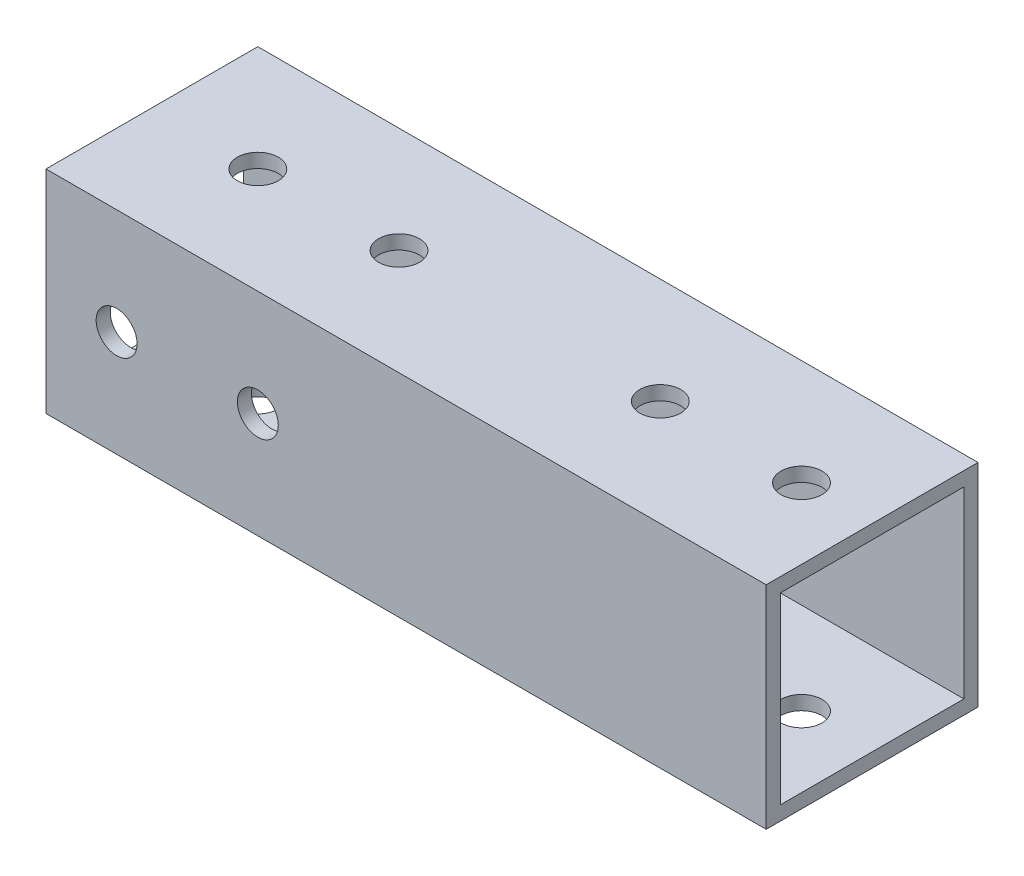
ISO-10303-21;
HEADER;
FILE_DESCRIPTION(('STEP AP214'),'2;1');
FILE_NAME('part.step','',(''),(''),'','','');
FILE_SCHEMA(('AUTOMOTIVE_DESIGN { 1 0 10303 214 1 1 1 1 }'));
ENDSEC;
DATA;
#1=APPLICATION_CONTEXT('core data for automotive mechanical design processes');
#2=APPLICATION_PROTOCOL_DEFINITION('international standard','automotive_design',2000,#1);
#3=PRODUCT_CONTEXT('',#1,'mechanical');
#4=PRODUCT('Part','Part','',(#3));
#5=PRODUCT_RELATED_PRODUCT_CATEGORY('part','',(#4));
#6=PRODUCT_DEFINITION_FORMATION('','',#4);
#7=PRODUCT_DEFINITION_CONTEXT('part definition',#1,'design');
#8=PRODUCT_DEFINITION('design','',#6,#7);
#9=PRODUCT_DEFINITION_SHAPE('','',#8);
#10=(LENGTH_UNIT() NAMED_UNIT(*) SI_UNIT(.MILLI.,.METRE.));
#11=(NAMED_UNIT(*) PLANE_ANGLE_UNIT() SI_UNIT($,.RADIAN.));
#12=(NAMED_UNIT(*) SI_UNIT($,.STERADIAN.) SOLID_ANGLE_UNIT());
#13=UNCERTAINTY_MEASURE_WITH_UNIT(LENGTH_MEASURE(1.E-05),#10,'distance_accuracy_value','');
#14=(GEOMETRIC_REPRESENTATION_CONTEXT(3) GLOBAL_UNCERTAINTY_ASSIGNED_CONTEXT((#13)) GLOBAL_UNIT_ASSIGNED_CONTEXT((#10,
#11,#12)) REPRESENTATION_CONTEXT('',''));
#15=CARTESIAN_POINT('',(0.,0.,0.));
#16=DIRECTION('',(0.,0.,1.));
#17=DIRECTION('',(1.,0.,0.));
#18=AXIS2_PLACEMENT_3D('',#15,#16,#17);
#19=CARTESIAN_POINT('',(51.,0.,0.));
#20=DIRECTION('',(-1.,0.,0.));
#21=DIRECTION('',(0.,0.,1.));
#22=AXIS2_PLACEMENT_3D('',#19,#20,#21);
#23=PLANE('',#22);
#24=DIRECTION('',(0.,1.,0.));
#25=VECTOR('',#24,1.);
#26=CARTESIAN_POINT('',(51.,-7.5,-7.5));
#27=LINE('',#26,#25);
#28=CARTESIAN_POINT('',(51.,-7.5,-7.5));
#29=VERTEX_POINT('',#28);
#30=CARTESIAN_POINT('',(51.,7.5,-7.5));
#31=VERTEX_POINT('',#30);
#32=EDGE_CURVE('E150',#29,#31,#27,.T.);
#33=ORIENTED_EDGE('',*,*,#32,.T.);
#34=DIRECTION('',(0.,0.,1.));
#35=VECTOR('',#34,1.);
#36=CARTESIAN_POINT('',(51.,7.5,7.5));
#37=LINE('',#36,#35);
#38=CARTESIAN_POINT('',(51.,7.5,7.5));
#39=VERTEX_POINT('',#38);
#40=EDGE_CURVE('E153',#31,#39,#37,.T.);
#41=ORIENTED_EDGE('',*,*,#40,.T.);
#42=DIRECTION('',(0.,-1.,0.));
#43=VECTOR('',#42,1.);
#44=CARTESIAN_POINT('',(51.,-7.5,7.5));
#45=LINE('',#44,#43);
#46=CARTESIAN_POINT('',(51.,-7.5,7.5));
#47=VERTEX_POINT('',#46);
#48=EDGE_CURVE('E156',#39,#47,#45,.T.);
#49=ORIENTED_EDGE('',*,*,#48,.T.);
#50=DIRECTION('',(0.,0.,-1.));
#51=VECTOR('',#50,1.);
#52=CARTESIAN_POINT('',(51.,-7.5,7.5));
#53=LINE('',#52,#51);
#54=EDGE_CURVE('E158',#47,#29,#53,.T.);
#55=ORIENTED_EDGE('',*,*,#54,.T.);
#56=EDGE_LOOP('',(#33,#41,#49,#55));
#57=FACE_BOUND('',#56,.T.);
#58=DIRECTION('',(0.,0.,-1.));
#59=VECTOR('',#58,1.);
#60=CARTESIAN_POINT('',(51.,-6.5,6.5));
#61=LINE('',#60,#59);
#62=CARTESIAN_POINT('',(51.,-6.5,6.5));
#63=VERTEX_POINT('',#62);
#64=CARTESIAN_POINT('',(51.,-6.5,-6.5));
#65=VERTEX_POINT('',#64);
#66=EDGE_CURVE('E112',#63,#65,#61,.T.);
#67=ORIENTED_EDGE('',*,*,#66,.F.);
#68=DIRECTION('',(0.,-1.,0.));
#69=VECTOR('',#68,1.);
#70=CARTESIAN_POINT('',(51.,-6.5,6.5));
#71=LINE('',#70,#69);
#72=CARTESIAN_POINT('',(51.,6.5,6.5));
#73=VERTEX_POINT('',#72);
#74=EDGE_CURVE('E134',#73,#63,#71,.T.);
#75=ORIENTED_EDGE('',*,*,#74,.F.);
#76=DIRECTION('',(0.,0.,1.));
#77=VECTOR('',#76,1.);
#78=CARTESIAN_POINT('',(51.,6.5,6.5));
#79=LINE('',#78,#77);
#80=CARTESIAN_POINT('',(51.,6.5,-6.5));
#81=VERTEX_POINT('',#80);
#82=EDGE_CURVE('E132',#81,#73,#79,.T.);
#83=ORIENTED_EDGE('',*,*,#82,.F.);
#84=DIRECTION('',(0.,1.,0.));
#85=VECTOR('',#84,1.);
#86=CARTESIAN_POINT('',(51.,-6.5,-6.5));
#87=LINE('',#86,#85);
#88=EDGE_CURVE('E120',#65,#81,#87,.T.);
#89=ORIENTED_EDGE('',*,*,#88,.F.);
#90=EDGE_LOOP('',(#67,#75,#83,#89));
#91=FACE_BOUND('',#90,.T.);
#92=ADVANCED_FACE('F45',(#57,#91),#23,.F.);
#93=CARTESIAN_POINT('',(0.,0.,0.));
#94=DIRECTION('',(-1.,0.,0.));
#95=DIRECTION('',(0.,0.,1.));
#96=AXIS2_PLACEMENT_3D('',#93,#94,#95);
#97=PLANE('',#96);
#98=DIRECTION('',(0.,1.,0.));
#99=VECTOR('',#98,1.);
#100=CARTESIAN_POINT('',(0.,-7.5,-7.5));
#101=LINE('',#100,#99);
#102=CARTESIAN_POINT('',(0.,-7.5,-7.5));
#103=VERTEX_POINT('',#102);
#104=CARTESIAN_POINT('',(0.,7.5,-7.5));
#105=VERTEX_POINT('',#104);
#106=EDGE_CURVE('E128',#103,#105,#101,.T.);
#107=ORIENTED_EDGE('',*,*,#106,.F.);
#108=DIRECTION('',(0.,0.,-1.));
#109=VECTOR('',#108,1.);
#110=CARTESIAN_POINT('',(0.,-7.5,7.5));
#111=LINE('',#110,#109);
#112=CARTESIAN_POINT('',(0.,-7.5,7.5));
#113=VERTEX_POINT('',#112);
#114=EDGE_CURVE('E154',#113,#103,#111,.T.);
#115=ORIENTED_EDGE('',*,*,#114,.F.);
#116=DIRECTION('',(0.,-1.,0.));
#117=VECTOR('',#116,1.);
#118=CARTESIAN_POINT('',(0.,-7.5,7.5));
#119=LINE('',#118,#117);
#120=CARTESIAN_POINT('',(0.,7.5,7.5));
#121=VERTEX_POINT('',#120);
#122=EDGE_CURVE('E165',#121,#113,#119,.T.);
#123=ORIENTED_EDGE('',*,*,#122,.F.);
#124=DIRECTION('',(0.,0.,1.));
#125=VECTOR('',#124,1.);
#126=CARTESIAN_POINT('',(0.,7.5,7.5));
#127=LINE('',#126,#125);
#128=EDGE_CURVE('E163',#105,#121,#127,.T.);
#129=ORIENTED_EDGE('',*,*,#128,.F.);
#130=EDGE_LOOP('',(#107,#115,#123,#129));
#131=FACE_BOUND('',#130,.T.);
#132=DIRECTION('',(0.,-1.,0.));
#133=VECTOR('',#132,1.);
#134=CARTESIAN_POINT('',(0.,-6.5,6.5));
#135=LINE('',#134,#133);
#136=CARTESIAN_POINT('',(0.,6.5,6.5));
#137=VERTEX_POINT('',#136);
#138=CARTESIAN_POINT('',(0.,-6.5,6.5));
#139=VERTEX_POINT('',#138);
#140=EDGE_CURVE('E121',#137,#139,#135,.T.);
#141=ORIENTED_EDGE('',*,*,#140,.T.);
#142=DIRECTION('',(0.,0.,-1.));
#143=VECTOR('',#142,1.);
#144=CARTESIAN_POINT('',(0.,-6.5,6.5));
#145=LINE('',#144,#143);
#146=CARTESIAN_POINT('',(0.,-6.5,-6.5));
#147=VERTEX_POINT('',#146);
#148=EDGE_CURVE('E70',#139,#147,#145,.T.);
#149=ORIENTED_EDGE('',*,*,#148,.T.);
#150=DIRECTION('',(0.,1.,0.));
#151=VECTOR('',#150,1.);
#152=CARTESIAN_POINT('',(0.,-6.5,-6.5));
#153=LINE('',#152,#151);
#154=CARTESIAN_POINT('',(0.,6.5,-6.5));
#155=VERTEX_POINT('',#154);
#156=EDGE_CURVE('E127',#147,#155,#153,.T.);
#157=ORIENTED_EDGE('',*,*,#156,.T.);
#158=DIRECTION('',(0.,0.,1.));
#159=VECTOR('',#158,1.);
#160=CARTESIAN_POINT('',(0.,6.5,6.5));
#161=LINE('',#160,#159);
#162=EDGE_CURVE('E142',#155,#137,#161,.T.);
#163=ORIENTED_EDGE('',*,*,#162,.T.);
#164=EDGE_LOOP('',(#141,#149,#157,#163));
#165=FACE_BOUND('',#164,.T.);
#166=ADVANCED_FACE('F283',(#131,#165),#97,.T.);
#167=CARTESIAN_POINT('',(51.,-7.5,-7.5));
#168=DIRECTION('',(0.,0.,1.));
#169=DIRECTION('',(1.,0.,0.));
#170=AXIS2_PLACEMENT_3D('',#167,#168,#169);
#171=PLANE('',#170);
#172=CARTESIAN_POINT('',(5.,0.,-7.5));
#173=DIRECTION('',(0.,0.,1.));
#174=DIRECTION('',(1.,0.,0.));
#175=AXIS2_PLACEMENT_3D('',#172,#173,#174);
#176=CIRCLE('',#175,1.45);
#177=CARTESIAN_POINT('',(6.45,0.,-7.5));
#178=VERTEX_POINT('',#177);
#179=EDGE_CURVE('E193',#178,#178,#176,.T.);
#180=ORIENTED_EDGE('',*,*,#179,.T.);
#181=EDGE_LOOP('',(#180));
#182=FACE_BOUND('',#181,.T.);
#183=CARTESIAN_POINT('',(15.,0.,-7.5));
#184=DIRECTION('',(0.,0.,1.));
#185=DIRECTION('',(1.,0.,0.));
#186=AXIS2_PLACEMENT_3D('',#183,#184,#185);
#187=CIRCLE('',#186,1.45);
#188=CARTESIAN_POINT('',(16.45,0.,-7.5));
#189=VERTEX_POINT('',#188);
#190=EDGE_CURVE('E209',#189,#189,#187,.T.);
#191=ORIENTED_EDGE('',*,*,#190,.T.);
#192=EDGE_LOOP('',(#191));
#193=FACE_BOUND('',#192,.T.);
#194=ORIENTED_EDGE('',*,*,#106,.T.);
#195=DIRECTION('',(-1.,0.,0.));
#196=VECTOR('',#195,1.);
#197=CARTESIAN_POINT('',(51.,7.5,-7.5));
#198=LINE('',#197,#196);
#199=EDGE_CURVE('E11',#31,#105,#198,.T.);
#200=ORIENTED_EDGE('',*,*,#199,.F.);
#201=ORIENTED_EDGE('',*,*,#32,.F.);
#202=DIRECTION('',(-1.,0.,0.));
#203=VECTOR('',#202,1.);
#204=CARTESIAN_POINT('',(51.,-7.5,-7.5));
#205=LINE('',#204,#203);
#206=EDGE_CURVE('E160',#29,#103,#205,.T.);
#207=ORIENTED_EDGE('',*,*,#206,.T.);
#208=EDGE_LOOP('',(#194,#200,#201,#207));
#209=FACE_BOUND('',#208,.T.);
#210=ADVANCED_FACE('F47',(#182,#193,#209),#171,.F.);
#211=CARTESIAN_POINT('',(51.,7.5,7.5));
#212=DIRECTION('',(0.,-1.,0.));
#213=DIRECTION('',(0.,0.,-1.));
#214=AXIS2_PLACEMENT_3D('',#211,#212,#213);
#215=PLANE('',#214);
#216=CARTESIAN_POINT('',(7.5,7.5,0.));
#217=DIRECTION('',(0.,1.,0.));
#218=DIRECTION('',(0.,0.,1.));
#219=AXIS2_PLACEMENT_3D('',#216,#217,#218);
#220=CIRCLE('',#219,1.45);
#221=CARTESIAN_POINT('',(7.5,7.5,1.45));
#222=VERTEX_POINT('',#221);
#223=EDGE_CURVE('E218',#222,#222,#220,.T.);
#224=ORIENTED_EDGE('',*,*,#223,.F.);
#225=EDGE_LOOP('',(#224));
#226=FACE_BOUND('',#225,.T.);
#227=CARTESIAN_POINT('',(36.,7.5,0.));
#228=DIRECTION('',(0.,1.,0.));
#229=DIRECTION('',(0.,0.,1.));
#230=AXIS2_PLACEMENT_3D('',#227,#228,#229);
#231=CIRCLE('',#230,1.45);
#232=CARTESIAN_POINT('',(36.,7.5,1.45));
#233=VERTEX_POINT('',#232);
#234=EDGE_CURVE('E222',#233,#233,#231,.T.);
#235=ORIENTED_EDGE('',*,*,#234,.F.);
#236=EDGE_LOOP('',(#235));
#237=FACE_BOUND('',#236,.T.);
#238=CARTESIAN_POINT('',(46.,7.5,0.));
#239=DIRECTION('',(0.,1.,0.));
#240=DIRECTION('',(0.,0.,1.));
#241=AXIS2_PLACEMENT_3D('',#238,#239,#240);
#242=CIRCLE('',#241,1.45);
#243=CARTESIAN_POINT('',(46.,7.5,1.45));
#244=VERTEX_POINT('',#243);
#245=EDGE_CURVE('E233',#244,#244,#242,.T.);
#246=ORIENTED_EDGE('',*,*,#245,.F.);
#247=EDGE_LOOP('',(#246));
#248=FACE_BOUND('',#247,.T.);
#249=CARTESIAN_POINT('',(17.5,7.5,0.));
#250=DIRECTION('',(0.,1.,0.));
#251=DIRECTION('',(0.,0.,1.));
#252=AXIS2_PLACEMENT_3D('',#249,#250,#251);
#253=CIRCLE('',#252,1.45);
#254=CARTESIAN_POINT('',(17.5,7.5,1.45));
#255=VERTEX_POINT('',#254);
#256=EDGE_CURVE('E221',#255,#255,#253,.T.);
#257=ORIENTED_EDGE('',*,*,#256,.F.);
#258=EDGE_LOOP('',(#257));
#259=FACE_BOUND('',#258,.T.);
#260=ORIENTED_EDGE('',*,*,#128,.T.);
#261=DIRECTION('',(-1.,0.,0.));
#262=VECTOR('',#261,1.);
#263=CARTESIAN_POINT('',(51.,7.5,7.5));
#264=LINE('',#263,#262);
#265=EDGE_CURVE('E54',#39,#121,#264,.T.);
#266=ORIENTED_EDGE('',*,*,#265,.F.);
#267=ORIENTED_EDGE('',*,*,#40,.F.);
#268=ORIENTED_EDGE('',*,*,#199,.T.);
#269=EDGE_LOOP('',(#260,#266,#267,#268));
#270=FACE_BOUND('',#269,.T.);
#271=ADVANCED_FACE('F287',(#226,#237,#248,#259,#270),#215,.F.);
#272=CARTESIAN_POINT('',(51.,-7.5,7.5));
#273=DIRECTION('',(0.,0.,-1.));
#274=DIRECTION('',(-1.,0.,0.));
#275=AXIS2_PLACEMENT_3D('',#272,#273,#274);
#276=PLANE('',#275);
#277=CARTESIAN_POINT('',(5.,0.,7.5));
#278=DIRECTION('',(0.,0.,1.));
#279=DIRECTION('',(1.,0.,0.));
#280=AXIS2_PLACEMENT_3D('',#277,#278,#279);
#281=CIRCLE('',#280,1.45);
#282=CARTESIAN_POINT('',(6.45,0.,7.5));
#283=VERTEX_POINT('',#282);
#284=EDGE_CURVE('E199',#283,#283,#281,.T.);
#285=ORIENTED_EDGE('',*,*,#284,.F.);
#286=EDGE_LOOP('',(#285));
#287=FACE_BOUND('',#286,.T.);
#288=CARTESIAN_POINT('',(15.,0.,7.5));
#289=DIRECTION('',(0.,0.,1.));
#290=DIRECTION('',(1.,0.,0.));
#291=AXIS2_PLACEMENT_3D('',#288,#289,#290);
#292=CIRCLE('',#291,1.45);
#293=CARTESIAN_POINT('',(16.45,0.,7.5));
#294=VERTEX_POINT('',#293);
#295=EDGE_CURVE('E204',#294,#294,#292,.T.);
#296=ORIENTED_EDGE('',*,*,#295,.F.);
#297=EDGE_LOOP('',(#296));
#298=FACE_BOUND('',#297,.T.);
#299=ORIENTED_EDGE('',*,*,#122,.T.);
#300=DIRECTION('',(-1.,0.,0.));
#301=VECTOR('',#300,1.);
#302=CARTESIAN_POINT('',(51.,-7.5,7.5));
#303=LINE('',#302,#301);
#304=EDGE_CURVE('E170',#47,#113,#303,.T.);
#305=ORIENTED_EDGE('',*,*,#304,.F.);
#306=ORIENTED_EDGE('',*,*,#48,.F.);
#307=ORIENTED_EDGE('',*,*,#265,.T.);
#308=EDGE_LOOP('',(#299,#305,#306,#307));
#309=FACE_BOUND('',#308,.T.);
#310=ADVANCED_FACE('F270',(#287,#298,#309),#276,.F.);
#311=CARTESIAN_POINT('',(51.,-7.5,7.5));
#312=DIRECTION('',(0.,1.,0.));
#313=DIRECTION('',(0.,0.,1.));
#314=AXIS2_PLACEMENT_3D('',#311,#312,#313);
#315=PLANE('',#314);
#316=CARTESIAN_POINT('',(7.5,-7.5,0.));
#317=DIRECTION('',(0.,1.,0.));
#318=DIRECTION('',(0.,0.,1.));
#319=AXIS2_PLACEMENT_3D('',#316,#317,#318);
#320=CIRCLE('',#319,1.45);
#321=CARTESIAN_POINT('',(7.5,-7.5,1.45));
#322=VERTEX_POINT('',#321);
#323=EDGE_CURVE('E179',#322,#322,#320,.T.);
#324=ORIENTED_EDGE('',*,*,#323,.T.);
#325=EDGE_LOOP('',(#324));
#326=FACE_BOUND('',#325,.T.);
#327=CARTESIAN_POINT('',(36.,-7.5,0.));
#328=DIRECTION('',(0.,1.,0.));
#329=DIRECTION('',(0.,0.,1.));
#330=AXIS2_PLACEMENT_3D('',#327,#328,#329);
#331=CIRCLE('',#330,1.45);
#332=CARTESIAN_POINT('',(36.,-7.5,1.45));
#333=VERTEX_POINT('',#332);
#334=EDGE_CURVE('E215',#333,#333,#331,.T.);
#335=ORIENTED_EDGE('',*,*,#334,.T.);
#336=EDGE_LOOP('',(#335));
#337=FACE_BOUND('',#336,.T.);
#338=CARTESIAN_POINT('',(46.,-7.5,0.));
#339=DIRECTION('',(0.,1.,0.));
#340=DIRECTION('',(0.,0.,1.));
#341=AXIS2_PLACEMENT_3D('',#338,#339,#340);
#342=CIRCLE('',#341,1.45);
#343=CARTESIAN_POINT('',(46.,-7.5,1.45));
#344=VERTEX_POINT('',#343);
#345=EDGE_CURVE('E225',#344,#344,#342,.T.);
#346=ORIENTED_EDGE('',*,*,#345,.T.);
#347=EDGE_LOOP('',(#346));
#348=FACE_BOUND('',#347,.T.);
#349=CARTESIAN_POINT('',(17.5,-7.5,0.));
#350=DIRECTION('',(0.,1.,0.));
#351=DIRECTION('',(0.,0.,1.));
#352=AXIS2_PLACEMENT_3D('',#349,#350,#351);
#353=CIRCLE('',#352,1.45);
#354=CARTESIAN_POINT('',(17.5,-7.5,1.45));
#355=VERTEX_POINT('',#354);
#356=EDGE_CURVE('E230',#355,#355,#353,.T.);
#357=ORIENTED_EDGE('',*,*,#356,.T.);
#358=EDGE_LOOP('',(#357));
#359=FACE_BOUND('',#358,.T.);
#360=ORIENTED_EDGE('',*,*,#114,.T.);
#361=ORIENTED_EDGE('',*,*,#206,.F.);
#362=ORIENTED_EDGE('',*,*,#54,.F.);
#363=ORIENTED_EDGE('',*,*,#304,.T.);
#364=EDGE_LOOP('',(#360,#361,#362,#363));
#365=FACE_BOUND('',#364,.T.);
#366=ADVANCED_FACE('F251',(#326,#337,#348,#359,#365),#315,.F.);
#367=CARTESIAN_POINT('',(51.,-6.5,6.5));
#368=DIRECTION('',(0.,1.,0.));
#369=DIRECTION('',(0.,0.,1.));
#370=AXIS2_PLACEMENT_3D('',#367,#368,#369);
#371=PLANE('',#370);
#372=CARTESIAN_POINT('',(7.5,-6.5,0.));
#373=DIRECTION('',(0.,1.,0.));
#374=DIRECTION('',(0.,0.,1.));
#375=AXIS2_PLACEMENT_3D('',#372,#373,#374);
#376=CIRCLE('',#375,1.45);
#377=CARTESIAN_POINT('',(7.5,-6.5,1.45));
#378=VERTEX_POINT('',#377);
#379=EDGE_CURVE('E140',#378,#378,#376,.T.);
#380=ORIENTED_EDGE('',*,*,#379,.F.);
#381=EDGE_LOOP('',(#380));
#382=FACE_BOUND('',#381,.T.);
#383=CARTESIAN_POINT('',(36.,-6.5,0.));
#384=DIRECTION('',(0.,1.,0.));
#385=DIRECTION('',(0.,0.,1.));
#386=AXIS2_PLACEMENT_3D('',#383,#384,#385);
#387=CIRCLE('',#386,1.45);
#388=CARTESIAN_POINT('',(36.,-6.5,1.45));
#389=VERTEX_POINT('',#388);
#390=EDGE_CURVE('E187',#389,#389,#387,.T.);
#391=ORIENTED_EDGE('',*,*,#390,.F.);
#392=EDGE_LOOP('',(#391));
#393=FACE_BOUND('',#392,.T.);
#394=CARTESIAN_POINT('',(46.,-6.5,0.));
#395=DIRECTION('',(0.,1.,0.));
#396=DIRECTION('',(0.,0.,1.));
#397=AXIS2_PLACEMENT_3D('',#394,#395,#396);
#398=CIRCLE('',#397,1.45);
#399=CARTESIAN_POINT('',(46.,-6.5,1.45));
#400=VERTEX_POINT('',#399);
#401=EDGE_CURVE('E183',#400,#400,#398,.T.);
#402=ORIENTED_EDGE('',*,*,#401,.F.);
#403=EDGE_LOOP('',(#402));
#404=FACE_BOUND('',#403,.T.);
#405=CARTESIAN_POINT('',(17.5,-6.5,0.));
#406=DIRECTION('',(0.,1.,0.));
#407=DIRECTION('',(0.,0.,1.));
#408=AXIS2_PLACEMENT_3D('',#405,#406,#407);
#409=CIRCLE('',#408,1.45);
#410=CARTESIAN_POINT('',(17.5,-6.5,1.45));
#411=VERTEX_POINT('',#410);
#412=EDGE_CURVE('E178',#411,#411,#409,.T.);
#413=ORIENTED_EDGE('',*,*,#412,.F.);
#414=EDGE_LOOP('',(#413));
#415=FACE_BOUND('',#414,.T.);
#416=ORIENTED_EDGE('',*,*,#148,.F.);
#417=DIRECTION('',(-1.,0.,0.));
#418=VECTOR('',#417,1.);
#419=CARTESIAN_POINT('',(51.,-6.5,6.5));
#420=LINE('',#419,#418);
#421=EDGE_CURVE('E116',#63,#139,#420,.T.);
#422=ORIENTED_EDGE('',*,*,#421,.F.);
#423=ORIENTED_EDGE('',*,*,#66,.T.);
#424=DIRECTION('',(-1.,0.,0.));
#425=VECTOR('',#424,1.);
#426=CARTESIAN_POINT('',(51.,-6.5,-6.5));
#427=LINE('',#426,#425);
#428=EDGE_CURVE('E115',#65,#147,#427,.T.);
#429=ORIENTED_EDGE('',*,*,#428,.T.);
#430=EDGE_LOOP('',(#416,#422,#423,#429));
#431=FACE_BOUND('',#430,.T.);
#432=ADVANCED_FACE('F114',(#382,#393,#404,#415,#431),#371,.T.);
#433=CARTESIAN_POINT('',(51.,-6.5,-6.5));
#434=DIRECTION('',(0.,0.,1.));
#435=DIRECTION('',(0.,-1.,0.));
#436=AXIS2_PLACEMENT_3D('',#433,#434,#435);
#437=PLANE('',#436);
#438=CARTESIAN_POINT('',(5.,0.,-6.5));
#439=DIRECTION('',(0.,0.,1.));
#440=DIRECTION('',(0.,-1.,0.));
#441=AXIS2_PLACEMENT_3D('',#438,#439,#440);
#442=CIRCLE('',#441,1.45);
#443=CARTESIAN_POINT('',(5.,-1.45,-6.5));
#444=VERTEX_POINT('',#443);
#445=EDGE_CURVE('E212',#444,#444,#442,.T.);
#446=ORIENTED_EDGE('',*,*,#445,.F.);
#447=EDGE_LOOP('',(#446));
#448=FACE_BOUND('',#447,.T.);
#449=CARTESIAN_POINT('',(15.,0.,-6.5));
#450=DIRECTION('',(0.,0.,1.));
#451=DIRECTION('',(0.,-1.,0.));
#452=AXIS2_PLACEMENT_3D('',#449,#450,#451);
#453=CIRCLE('',#452,1.45);
#454=CARTESIAN_POINT('',(15.,-1.45,-6.5));
#455=VERTEX_POINT('',#454);
#456=EDGE_CURVE('E192',#455,#455,#453,.T.);
#457=ORIENTED_EDGE('',*,*,#456,.F.);
#458=EDGE_LOOP('',(#457));
#459=FACE_BOUND('',#458,.T.);
#460=ORIENTED_EDGE('',*,*,#156,.F.);
#461=ORIENTED_EDGE('',*,*,#428,.F.);
#462=ORIENTED_EDGE('',*,*,#88,.T.);
#463=DIRECTION('',(-1.,0.,0.));
#464=VECTOR('',#463,1.);
#465=CARTESIAN_POINT('',(51.,6.5,-6.5));
#466=LINE('',#465,#464);
#467=EDGE_CURVE('E129',#81,#155,#466,.T.);
#468=ORIENTED_EDGE('',*,*,#467,.T.);
#469=EDGE_LOOP('',(#460,#461,#462,#468));
#470=FACE_BOUND('',#469,.T.);
#471=ADVANCED_FACE('F124',(#448,#459,#470),#437,.T.);
#472=CARTESIAN_POINT('',(51.,6.5,6.5));
#473=DIRECTION('',(0.,-1.,0.));
#474=DIRECTION('',(0.,0.,-1.));
#475=AXIS2_PLACEMENT_3D('',#472,#473,#474);
#476=PLANE('',#475);
#477=CARTESIAN_POINT('',(7.5,6.5,0.));
#478=DIRECTION('',(0.,-1.,0.));
#479=DIRECTION('',(0.,0.,-1.));
#480=AXIS2_PLACEMENT_3D('',#477,#478,#479);
#481=CIRCLE('',#480,1.45);
#482=CARTESIAN_POINT('',(7.5,6.5,-1.45));
#483=VERTEX_POINT('',#482);
#484=EDGE_CURVE('E188',#483,#483,#481,.T.);
#485=ORIENTED_EDGE('',*,*,#484,.F.);
#486=EDGE_LOOP('',(#485));
#487=FACE_BOUND('',#486,.T.);
#488=CARTESIAN_POINT('',(36.,6.5,0.));
#489=DIRECTION('',(0.,-1.,0.));
#490=DIRECTION('',(0.,0.,-1.));
#491=AXIS2_PLACEMENT_3D('',#488,#489,#490);
#492=CIRCLE('',#491,1.45);
#493=CARTESIAN_POINT('',(36.,6.5,-1.45));
#494=VERTEX_POINT('',#493);
#495=EDGE_CURVE('E184',#494,#494,#492,.T.);
#496=ORIENTED_EDGE('',*,*,#495,.F.);
#497=EDGE_LOOP('',(#496));
#498=FACE_BOUND('',#497,.T.);
#499=CARTESIAN_POINT('',(46.,6.5,0.));
#500=DIRECTION('',(0.,-1.,0.));
#501=DIRECTION('',(0.,0.,-1.));
#502=AXIS2_PLACEMENT_3D('',#499,#500,#501);
#503=CIRCLE('',#502,1.45);
#504=CARTESIAN_POINT('',(46.,6.5,-1.45));
#505=VERTEX_POINT('',#504);
#506=EDGE_CURVE('E180',#505,#505,#503,.T.);
#507=ORIENTED_EDGE('',*,*,#506,.F.);
#508=EDGE_LOOP('',(#507));
#509=FACE_BOUND('',#508,.T.);
#510=CARTESIAN_POINT('',(17.5,6.5,0.));
#511=DIRECTION('',(0.,-1.,0.));
#512=DIRECTION('',(0.,0.,-1.));
#513=AXIS2_PLACEMENT_3D('',#510,#511,#512);
#514=CIRCLE('',#513,1.45);
#515=CARTESIAN_POINT('',(17.5,6.5,-1.45));
#516=VERTEX_POINT('',#515);
#517=EDGE_CURVE('E175',#516,#516,#514,.T.);
#518=ORIENTED_EDGE('',*,*,#517,.F.);
#519=EDGE_LOOP('',(#518));
#520=FACE_BOUND('',#519,.T.);
#521=ORIENTED_EDGE('',*,*,#162,.F.);
#522=ORIENTED_EDGE('',*,*,#467,.F.);
#523=ORIENTED_EDGE('',*,*,#82,.T.);
#524=DIRECTION('',(-1.,0.,0.));
#525=VECTOR('',#524,1.);
#526=CARTESIAN_POINT('',(51.,6.5,6.5));
#527=LINE('',#526,#525);
#528=EDGE_CURVE('E62',#73,#137,#527,.T.);
#529=ORIENTED_EDGE('',*,*,#528,.T.);
#530=EDGE_LOOP('',(#521,#522,#523,#529));
#531=FACE_BOUND('',#530,.T.);
#532=ADVANCED_FACE('F310',(#487,#498,#509,#520,#531),#476,.T.);
#533=CARTESIAN_POINT('',(51.,-6.5,6.5));
#534=DIRECTION('',(0.,0.,-1.));
#535=DIRECTION('',(-1.,0.,0.));
#536=AXIS2_PLACEMENT_3D('',#533,#534,#535);
#537=PLANE('',#536);
#538=CARTESIAN_POINT('',(5.,0.,6.5));
#539=DIRECTION('',(0.,0.,-1.));
#540=DIRECTION('',(-1.,0.,0.));
#541=AXIS2_PLACEMENT_3D('',#538,#539,#540);
#542=CIRCLE('',#541,1.45);
#543=CARTESIAN_POINT('',(3.55,0.,6.5));
#544=VERTEX_POINT('',#543);
#545=EDGE_CURVE('E49',#544,#544,#542,.T.);
#546=ORIENTED_EDGE('',*,*,#545,.F.);
#547=EDGE_LOOP('',(#546));
#548=FACE_BOUND('',#547,.T.);
#549=CARTESIAN_POINT('',(15.,0.,6.5));
#550=DIRECTION('',(0.,0.,-1.));
#551=DIRECTION('',(-1.,0.,0.));
#552=AXIS2_PLACEMENT_3D('',#549,#550,#551);
#553=CIRCLE('',#552,1.45);
#554=CARTESIAN_POINT('',(13.55,0.,6.5));
#555=VERTEX_POINT('',#554);
#556=EDGE_CURVE('E190',#555,#555,#553,.T.);
#557=ORIENTED_EDGE('',*,*,#556,.F.);
#558=EDGE_LOOP('',(#557));
#559=FACE_BOUND('',#558,.T.);
#560=ORIENTED_EDGE('',*,*,#140,.F.);
#561=ORIENTED_EDGE('',*,*,#528,.F.);
#562=ORIENTED_EDGE('',*,*,#74,.T.);
#563=ORIENTED_EDGE('',*,*,#421,.T.);
#564=EDGE_LOOP('',(#560,#561,#562,#563));
#565=FACE_BOUND('',#564,.T.);
#566=ADVANCED_FACE('F314',(#548,#559,#565),#537,.T.);
#567=CARTESIAN_POINT('',(17.5,-7.5,0.));
#568=DIRECTION('',(0.,1.,0.));
#569=DIRECTION('',(0.,0.,1.));
#570=AXIS2_PLACEMENT_3D('',#567,#568,#569);
#571=CYLINDRICAL_SURFACE('',#570,1.45);
#572=ORIENTED_EDGE('',*,*,#517,.T.);
#573=EDGE_LOOP('',(#572));
#574=FACE_BOUND('',#573,.T.);
#575=ORIENTED_EDGE('',*,*,#256,.T.);
#576=EDGE_LOOP('',(#575));
#577=FACE_BOUND('',#576,.T.);
#578=ADVANCED_FACE('F265',(#574,#577),#571,.F.);
#579=CARTESIAN_POINT('',(46.,-7.5,0.));
#580=DIRECTION('',(0.,1.,0.));
#581=DIRECTION('',(0.,0.,1.));
#582=AXIS2_PLACEMENT_3D('',#579,#580,#581);
#583=CYLINDRICAL_SURFACE('',#582,1.45);
#584=ORIENTED_EDGE('',*,*,#506,.T.);
#585=EDGE_LOOP('',(#584));
#586=FACE_BOUND('',#585,.T.);
#587=ORIENTED_EDGE('',*,*,#245,.T.);
#588=EDGE_LOOP('',(#587));
#589=FACE_BOUND('',#588,.T.);
#590=ADVANCED_FACE('F319',(#586,#589),#583,.F.);
#591=CARTESIAN_POINT('',(36.,-7.5,0.));
#592=DIRECTION('',(0.,1.,0.));
#593=DIRECTION('',(0.,0.,1.));
#594=AXIS2_PLACEMENT_3D('',#591,#592,#593);
#595=CYLINDRICAL_SURFACE('',#594,1.45);
#596=ORIENTED_EDGE('',*,*,#495,.T.);
#597=EDGE_LOOP('',(#596));
#598=FACE_BOUND('',#597,.T.);
#599=ORIENTED_EDGE('',*,*,#234,.T.);
#600=EDGE_LOOP('',(#599));
#601=FACE_BOUND('',#600,.T.);
#602=ADVANCED_FACE('F321',(#598,#601),#595,.F.);
#603=CARTESIAN_POINT('',(7.5,-7.5,0.));
#604=DIRECTION('',(0.,1.,0.));
#605=DIRECTION('',(0.,0.,1.));
#606=AXIS2_PLACEMENT_3D('',#603,#604,#605);
#607=CYLINDRICAL_SURFACE('',#606,1.45);
#608=ORIENTED_EDGE('',*,*,#484,.T.);
#609=EDGE_LOOP('',(#608));
#610=FACE_BOUND('',#609,.T.);
#611=ORIENTED_EDGE('',*,*,#223,.T.);
#612=EDGE_LOOP('',(#611));
#613=FACE_BOUND('',#612,.T.);
#614=ADVANCED_FACE('F263',(#610,#613),#607,.F.);
#615=ORIENTED_EDGE('',*,*,#412,.T.);
#616=EDGE_LOOP('',(#615));
#617=FACE_BOUND('',#616,.T.);
#618=ORIENTED_EDGE('',*,*,#356,.F.);
#619=EDGE_LOOP('',(#618));
#620=FACE_BOUND('',#619,.T.);
#621=ADVANCED_FACE('F259',(#617,#620),#571,.F.);
#622=ORIENTED_EDGE('',*,*,#401,.T.);
#623=EDGE_LOOP('',(#622));
#624=FACE_BOUND('',#623,.T.);
#625=ORIENTED_EDGE('',*,*,#345,.F.);
#626=EDGE_LOOP('',(#625));
#627=FACE_BOUND('',#626,.T.);
#628=ADVANCED_FACE('F262',(#624,#627),#583,.F.);
#629=ORIENTED_EDGE('',*,*,#390,.T.);
#630=EDGE_LOOP('',(#629));
#631=FACE_BOUND('',#630,.T.);
#632=ORIENTED_EDGE('',*,*,#334,.F.);
#633=EDGE_LOOP('',(#632));
#634=FACE_BOUND('',#633,.T.);
#635=ADVANCED_FACE('F329',(#631,#634),#595,.F.);
#636=ORIENTED_EDGE('',*,*,#379,.T.);
#637=EDGE_LOOP('',(#636));
#638=FACE_BOUND('',#637,.T.);
#639=ORIENTED_EDGE('',*,*,#323,.F.);
#640=EDGE_LOOP('',(#639));
#641=FACE_BOUND('',#640,.T.);
#642=ADVANCED_FACE('F246',(#638,#641),#607,.F.);
#643=CARTESIAN_POINT('',(15.,0.,-7.5));
#644=DIRECTION('',(0.,0.,1.));
#645=DIRECTION('',(1.,0.,0.));
#646=AXIS2_PLACEMENT_3D('',#643,#644,#645);
#647=CYLINDRICAL_SURFACE('',#646,1.45);
#648=ORIENTED_EDGE('',*,*,#556,.T.);
#649=EDGE_LOOP('',(#648));
#650=FACE_BOUND('',#649,.T.);
#651=ORIENTED_EDGE('',*,*,#295,.T.);
#652=EDGE_LOOP('',(#651));
#653=FACE_BOUND('',#652,.T.);
#654=ADVANCED_FACE('F333',(#650,#653),#647,.F.);
#655=CARTESIAN_POINT('',(5.,0.,-7.5));
#656=DIRECTION('',(0.,0.,1.));
#657=DIRECTION('',(1.,0.,0.));
#658=AXIS2_PLACEMENT_3D('',#655,#656,#657);
#659=CYLINDRICAL_SURFACE('',#658,1.45);
#660=ORIENTED_EDGE('',*,*,#545,.T.);
#661=EDGE_LOOP('',(#660));
#662=FACE_BOUND('',#661,.T.);
#663=ORIENTED_EDGE('',*,*,#284,.T.);
#664=EDGE_LOOP('',(#663));
#665=FACE_BOUND('',#664,.T.);
#666=ADVANCED_FACE('F336',(#662,#665),#659,.F.);
#667=ORIENTED_EDGE('',*,*,#456,.T.);
#668=EDGE_LOOP('',(#667));
#669=FACE_BOUND('',#668,.T.);
#670=ORIENTED_EDGE('',*,*,#190,.F.);
#671=EDGE_LOOP('',(#670));
#672=FACE_BOUND('',#671,.T.);
#673=ADVANCED_FACE('F337',(#669,#672),#647,.F.);
#674=ORIENTED_EDGE('',*,*,#445,.T.);
#675=EDGE_LOOP('',(#674));
#676=FACE_BOUND('',#675,.T.);
#677=ORIENTED_EDGE('',*,*,#179,.F.);
#678=EDGE_LOOP('',(#677));
#679=FACE_BOUND('',#678,.T.);
#680=ADVANCED_FACE('F340',(#676,#679),#659,.F.);
#681=CLOSED_SHELL('',(#92,#166,#210,#271,#310,#366,#432,#471,#532,#566,#578,#590,#602,#614,#621,
#628,#635,#642,#654,#666,#673,#680));
#682=MANIFOLD_SOLID_BREP('B2',#681);
#683=ADVANCED_BREP_SHAPE_REPRESENTATION('',(#18,#682),#14);
#684=SHAPE_DEFINITION_REPRESENTATION(#9,#683);
ENDSEC;
END-ISO-10303-21;
